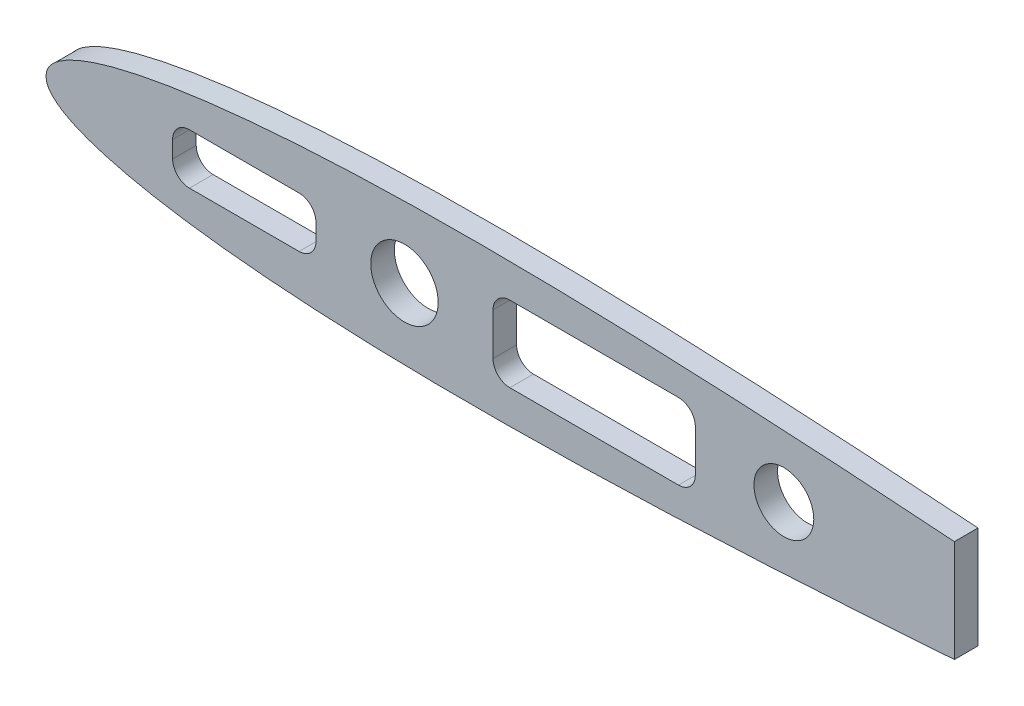
ISO-10303-21;
HEADER;
FILE_DESCRIPTION(('STEP AP214'),'2;1');
FILE_NAME('part.step','',(''),(''),'','','');
FILE_SCHEMA(('AUTOMOTIVE_DESIGN { 1 0 10303 214 1 1 1 1 }'));
ENDSEC;
DATA;
#1=APPLICATION_CONTEXT('core data for automotive mechanical design processes');
#2=APPLICATION_PROTOCOL_DEFINITION('international standard','automotive_design',2000,#1);
#3=PRODUCT_CONTEXT('',#1,'mechanical');
#4=PRODUCT('Part','Part','',(#3));
#5=PRODUCT_RELATED_PRODUCT_CATEGORY('part','',(#4));
#6=PRODUCT_DEFINITION_FORMATION('','',#4);
#7=PRODUCT_DEFINITION_CONTEXT('part definition',#1,'design');
#8=PRODUCT_DEFINITION('design','',#6,#7);
#9=PRODUCT_DEFINITION_SHAPE('','',#8);
#10=(LENGTH_UNIT() NAMED_UNIT(*) SI_UNIT(.MILLI.,.METRE.));
#11=(NAMED_UNIT(*) PLANE_ANGLE_UNIT() SI_UNIT($,.RADIAN.));
#12=(NAMED_UNIT(*) SI_UNIT($,.STERADIAN.) SOLID_ANGLE_UNIT());
#13=UNCERTAINTY_MEASURE_WITH_UNIT(LENGTH_MEASURE(1.E-05),#10,'distance_accuracy_value','');
#14=(GEOMETRIC_REPRESENTATION_CONTEXT(3) GLOBAL_UNCERTAINTY_ASSIGNED_CONTEXT((#13)) GLOBAL_UNIT_ASSIGNED_CONTEXT((#10,
#11,#12)) REPRESENTATION_CONTEXT('',''));
#15=CARTESIAN_POINT('',(0.,0.,0.));
#16=DIRECTION('',(0.,0.,1.));
#17=DIRECTION('',(1.,0.,0.));
#18=AXIS2_PLACEMENT_3D('',#15,#16,#17);
#19=CARTESIAN_POINT('',(217.74763411893,0.,1.4));
#20=DIRECTION('',(1.,0.,0.));
#21=DIRECTION('',(0.,0.,-1.));
#22=AXIS2_PLACEMENT_3D('',#19,#20,#21);
#23=PLANE('',#22);
#24=DIRECTION('',(0.,-1.,0.));
#25=VECTOR('',#24,1.);
#26=CARTESIAN_POINT('',(217.74763411893,0.,-1.4));
#27=LINE('',#26,#25);
#28=CARTESIAN_POINT('',(217.74763411893,6.05811307778919,-1.4));
#29=VERTEX_POINT('',#28);
#30=CARTESIAN_POINT('',(217.74763411893,-6.05811307778918,-1.4));
#31=VERTEX_POINT('',#30);
#32=EDGE_CURVE('E178',#29,#31,#27,.T.);
#33=ORIENTED_EDGE('',*,*,#32,.F.);
#34=DIRECTION('',(0.,0.,-1.));
#35=VECTOR('',#34,1.);
#36=CARTESIAN_POINT('',(217.74763411893,6.05811307778919,1.4));
#37=LINE('',#36,#35);
#38=CARTESIAN_POINT('',(217.74763411893,6.05811307778919,1.4));
#39=VERTEX_POINT('',#38);
#40=EDGE_CURVE('E11',#39,#29,#37,.T.);
#41=ORIENTED_EDGE('',*,*,#40,.F.);
#42=DIRECTION('',(0.,-1.,0.));
#43=VECTOR('',#42,1.);
#44=CARTESIAN_POINT('',(217.74763411893,0.,1.4));
#45=LINE('',#44,#43);
#46=CARTESIAN_POINT('',(217.74763411893,-6.05811307778918,1.4));
#47=VERTEX_POINT('',#46);
#48=EDGE_CURVE('E177',#39,#47,#45,.T.);
#49=ORIENTED_EDGE('',*,*,#48,.T.);
#50=DIRECTION('',(0.,0.,-1.));
#51=VECTOR('',#50,1.);
#52=CARTESIAN_POINT('',(217.74763411893,-6.05811307778918,1.4));
#53=LINE('',#52,#51);
#54=EDGE_CURVE('E122',#47,#31,#53,.T.);
#55=ORIENTED_EDGE('',*,*,#54,.T.);
#56=EDGE_LOOP('',(#33,#41,#49,#55));
#57=FACE_BOUND('',#56,.T.);
#58=ADVANCED_FACE('F35',(#57),#23,.T.);
#59=CARTESIAN_POINT('',(280.,0.1785,1.4));
#60=CARTESIAN_POINT('',(279.592043703671,0.226075897783467,1.4));
#61=CARTESIAN_POINT('',(278.452596210234,0.358958360844463,1.4));
#62=CARTESIAN_POINT('',(276.385426802208,0.596436481937331,1.4));
#63=CARTESIAN_POINT('',(273.651166983567,0.905304265461348,1.4));
#64=CARTESIAN_POINT('',(270.455833183168,1.25859090467058,1.4));
#65=CARTESIAN_POINT('',(266.898988861825,1.64260730411104,1.4));
#66=CARTESIAN_POINT('',(263.047743378214,2.04785660385741,1.4));
#67=CARTESIAN_POINT('',(258.952644661846,2.46718813772148,1.4));
#68=CARTESIAN_POINT('',(253.11611192075,3.04786904369115,1.4));
#69=CARTESIAN_POINT('',(247.071089235748,3.62220530992837,1.4));
#70=CARTESIAN_POINT('',(240.854179313273,4.18491264898859,1.4));
#71=CARTESIAN_POINT('',(236.038226964104,4.60581174883637,1.4));
#72=CARTESIAN_POINT('',(231.150377302514,5.0173511026198,1.4));
#73=CARTESIAN_POINT('',(226.209311113549,5.41695826474113,1.4));
#74=CARTESIAN_POINT('',(221.232257466585,5.802244474926,1.4));
#75=CARTESIAN_POINT('',(216.235178286272,6.17086457697306,1.4));
#76=CARTESIAN_POINT('',(211.232977593233,6.52047434958791,1.4));
#77=CARTESIAN_POINT('',(206.239642946259,6.84887299963153,1.4));
#78=CARTESIAN_POINT('',(201.268368916985,7.15382688632495,1.4));
#79=CARTESIAN_POINT('',(196.331634567492,7.43310533690328,1.4));
#80=CARTESIAN_POINT('',(191.441311474098,7.68460443906704,1.4));
#81=CARTESIAN_POINT('',(186.608700126931,7.90621829286941,1.4));
#82=CARTESIAN_POINT('',(181.844626933159,8.09595849303594,1.4));
#83=CARTESIAN_POINT('',(177.159453511195,8.25195768192942,1.4));
#84=CARTESIAN_POINT('',(172.563150271755,8.37248656398387,1.4));
#85=CARTESIAN_POINT('',(168.065295924147,8.45595366245417,1.4));
#86=CARTESIAN_POINT('',(163.675147454163,8.5010026998616,1.4));
#87=CARTESIAN_POINT('',(159.401643403725,8.50652296727326,1.4));
#88=CARTESIAN_POINT('',(155.253439755899,8.47152880790102,1.4));
#89=CARTESIAN_POINT('',(151.238917925322,8.39550607585732,1.4));
#90=CARTESIAN_POINT('',(147.366223919106,8.27798597685019,1.4));
#91=CARTESIAN_POINT('',(143.643266298458,8.11897556141504,1.4));
#92=CARTESIAN_POINT('',(140.077743555427,7.91867894287145,1.4));
#93=CARTESIAN_POINT('',(136.677139412155,7.67760454203032,1.4));
#94=CARTESIAN_POINT('',(133.44876289533,7.39648056861162,1.4));
#95=CARTESIAN_POINT('',(130.399721685833,7.07642431038863,1.4));
#96=CARTESIAN_POINT('',(127.536961088608,6.71865034112428,1.4));
#97=CARTESIAN_POINT('',(124.867245825052,6.32466607739586,1.4));
#98=CARTESIAN_POINT('',(122.397158973637,5.89612056643678,1.4));
#99=CARTESIAN_POINT('',(120.133109351335,5.43479747619412,1.4));
#100=CARTESIAN_POINT('',(118.081312132678,4.94256764101073,1.4));
#101=CARTESIAN_POINT('',(116.247665797811,4.42139238611828,1.4));
#102=CARTESIAN_POINT('',(114.637939719778,3.87306046577258,1.4));
#103=CARTESIAN_POINT('',(113.256788366372,3.29930923783808,1.4));
#104=CARTESIAN_POINT('',(112.109835923497,2.70130638754162,1.4));
#105=CARTESIAN_POINT('',(111.196336340545,2.07855523302877,1.4));
#106=CARTESIAN_POINT('',(110.530223641577,1.42706975809109,1.4));
#107=CARTESIAN_POINT('',(110.085538217979,0.734230220465984,1.4));
#108=CARTESIAN_POINT('',(110.027578175867,0.236721440142773,1.4));
#109=CARTESIAN_POINT('',(110.,0.,1.4));
#110=B_SPLINE_CURVE_WITH_KNOTS('',3,(#59,#60,#61,#62,#63,#64,#65,#66,#67,#68,#69,#70,#71,#72,
#73,#74,#75,#76,#77,#78,#79,#80,#81,#82,#83,#84,#85,#86,#87,#88,#89,#90,#91,#92,#93,#94,#95,#96,
#97,#98,#99,#100,#101,#102,#103,#104,#105,#106,#107,#108,#109),.UNSPECIFIED.,.F.,.F.,(4,1,1,1,1,
1,1,1,1,1,1,1,1,1,1,1,1,1,1,1,1,1,1,1,1,1,1,1,1,1,1,1,1,1,1,1,1,1,1,1,1,1,1,1,1,1,1,1,4),(0.,
0.00714472364101537,0.0199556607345446,0.0361960612227423,0.0550111837630616,0.0758789375062231,
0.0984288660950085,0.122375554002083,0.147487885417653,0.200459747132314,0.228005170188377,
0.256076453638138,0.284555151070125,0.31333276259982,0.342309553949656,0.371392651251454,
0.400495752426115,0.429537687145242,0.458441905920554,0.487136113386761,0.515551917136779,
0.543623846405843,0.571289984327897,0.598490809568145,0.625169613225281,0.651272029103837,
0.676746157949116,0.701541790883913,0.725611016556625,0.74890783507394,0.771387785068823,
0.793008138575143,0.813728032856974,0.833507815357633,0.852309696093785,0.870097310144046,
0.886835918069106,0.902492781713446,0.917037139140432,0.930441053860646,0.942679762162792,
0.953733567025024,0.963589785484808,0.97224701929817,0.979722225388436,0.986065145275041,
0.991385258303778,0.995900988803729,1.),.UNSPECIFIED.);
#111=DIRECTION('',(0.,0.,-1.));
#112=VECTOR('',#111,1.);
#113=SURFACE_OF_LINEAR_EXTRUSION('',#110,#112);
#114=CARTESIAN_POINT('',(280.,0.1785,-1.4));
#115=CARTESIAN_POINT('',(279.592043703671,0.226075897783467,-1.4));
#116=CARTESIAN_POINT('',(278.452596210234,0.358958360844463,-1.4));
#117=CARTESIAN_POINT('',(276.385426802208,0.596436481937331,-1.4));
#118=CARTESIAN_POINT('',(273.651166983567,0.905304265461348,-1.4));
#119=CARTESIAN_POINT('',(270.455833183168,1.25859090467058,-1.4));
#120=CARTESIAN_POINT('',(266.898988861825,1.64260730411104,-1.4));
#121=CARTESIAN_POINT('',(263.047743378214,2.04785660385741,-1.4));
#122=CARTESIAN_POINT('',(258.952644661846,2.46718813772148,-1.4));
#123=CARTESIAN_POINT('',(253.11611192075,3.04786904369115,-1.4));
#124=CARTESIAN_POINT('',(247.071089235748,3.62220530992837,-1.4));
#125=CARTESIAN_POINT('',(240.854179313273,4.18491264898859,-1.4));
#126=CARTESIAN_POINT('',(236.038226964104,4.60581174883637,-1.4));
#127=CARTESIAN_POINT('',(231.150377302514,5.0173511026198,-1.4));
#128=CARTESIAN_POINT('',(226.209311113549,5.41695826474113,-1.4));
#129=CARTESIAN_POINT('',(221.232257466585,5.802244474926,-1.4));
#130=CARTESIAN_POINT('',(216.235178286272,6.17086457697306,-1.4));
#131=CARTESIAN_POINT('',(211.232977593233,6.52047434958791,-1.4));
#132=CARTESIAN_POINT('',(206.239642946259,6.84887299963153,-1.4));
#133=CARTESIAN_POINT('',(201.268368916985,7.15382688632495,-1.4));
#134=CARTESIAN_POINT('',(196.331634567492,7.43310533690328,-1.4));
#135=CARTESIAN_POINT('',(191.441311474098,7.68460443906704,-1.4));
#136=CARTESIAN_POINT('',(186.608700126931,7.90621829286941,-1.4));
#137=CARTESIAN_POINT('',(181.844626933159,8.09595849303594,-1.4));
#138=CARTESIAN_POINT('',(177.159453511195,8.25195768192942,-1.4));
#139=CARTESIAN_POINT('',(172.563150271755,8.37248656398387,-1.4));
#140=CARTESIAN_POINT('',(168.065295924147,8.45595366245417,-1.4));
#141=CARTESIAN_POINT('',(163.675147454163,8.5010026998616,-1.4));
#142=CARTESIAN_POINT('',(159.401643403725,8.50652296727326,-1.4));
#143=CARTESIAN_POINT('',(155.253439755899,8.47152880790102,-1.4));
#144=CARTESIAN_POINT('',(151.238917925322,8.39550607585732,-1.4));
#145=CARTESIAN_POINT('',(147.366223919106,8.27798597685019,-1.4));
#146=CARTESIAN_POINT('',(143.643266298458,8.11897556141504,-1.4));
#147=CARTESIAN_POINT('',(140.077743555427,7.91867894287145,-1.4));
#148=CARTESIAN_POINT('',(136.677139412155,7.67760454203032,-1.4));
#149=CARTESIAN_POINT('',(133.44876289533,7.39648056861162,-1.4));
#150=CARTESIAN_POINT('',(130.399721685833,7.07642431038863,-1.4));
#151=CARTESIAN_POINT('',(127.536961088608,6.71865034112428,-1.4));
#152=CARTESIAN_POINT('',(124.867245825052,6.32466607739586,-1.4));
#153=CARTESIAN_POINT('',(122.397158973637,5.89612056643678,-1.4));
#154=CARTESIAN_POINT('',(120.133109351335,5.43479747619412,-1.4));
#155=CARTESIAN_POINT('',(118.081312132678,4.94256764101073,-1.4));
#156=CARTESIAN_POINT('',(116.247665797811,4.42139238611828,-1.4));
#157=CARTESIAN_POINT('',(114.637939719778,3.87306046577258,-1.4));
#158=CARTESIAN_POINT('',(113.256788366372,3.29930923783808,-1.4));
#159=CARTESIAN_POINT('',(112.109835923497,2.70130638754162,-1.4));
#160=CARTESIAN_POINT('',(111.196336340545,2.07855523302877,-1.4));
#161=CARTESIAN_POINT('',(110.530223641577,1.42706975809109,-1.4));
#162=CARTESIAN_POINT('',(110.085538217979,0.734230220465984,-1.4));
#163=CARTESIAN_POINT('',(110.027578175867,0.236721440142773,-1.4));
#164=CARTESIAN_POINT('',(110.,0.,-1.4));
#165=B_SPLINE_CURVE_WITH_KNOTS('',3,(#114,#115,#116,#117,#118,#119,#120,#121,#122,#123,#124,
#125,#126,#127,#128,#129,#130,#131,#132,#133,#134,#135,#136,#137,#138,#139,#140,#141,#142,#143,
#144,#145,#146,#147,#148,#149,#150,#151,#152,#153,#154,#155,#156,#157,#158,#159,#160,#161,#162,
#163,#164),.UNSPECIFIED.,.F.,.F.,(4,1,1,1,1,1,1,1,1,1,1,1,1,1,1,1,1,1,1,1,1,1,1,1,1,1,1,1,1,1,1,
1,1,1,1,1,1,1,1,1,1,1,1,1,1,1,1,1,4),(0.,0.00714472364101537,0.0199556607345446,
0.0361960612227423,0.0550111837630616,0.0758789375062231,0.0984288660950085,0.122375554002083,
0.147487885417653,0.200459747132314,0.228005170188377,0.256076453638138,0.284555151070125,
0.31333276259982,0.342309553949656,0.371392651251454,0.400495752426115,0.429537687145242,
0.458441905920554,0.487136113386761,0.515551917136779,0.543623846405843,0.571289984327897,
0.598490809568145,0.625169613225281,0.651272029103837,0.676746157949116,0.701541790883913,
0.725611016556625,0.74890783507394,0.771387785068823,0.793008138575143,0.813728032856974,
0.833507815357633,0.852309696093785,0.870097310144046,0.886835918069106,0.902492781713446,
0.917037139140432,0.930441053860646,0.942679762162792,0.953733567025024,0.963589785484808,
0.97224701929817,0.979722225388436,0.986065145275041,0.991385258303778,0.995900988803729,1.),.UNSPECIFIED.);
#166=CARTESIAN_POINT('',(110.,0.,-1.4));
#167=VERTEX_POINT('',#166);
#168=EDGE_CURVE('E338',#29,#167,#165,.T.);
#169=ORIENTED_EDGE('',*,*,#168,.T.);
#170=DIRECTION('',(0.,0.,-1.));
#171=VECTOR('',#170,1.);
#172=CARTESIAN_POINT('',(110.,0.,1.4));
#173=LINE('',#172,#171);
#174=CARTESIAN_POINT('',(110.,0.,1.4));
#175=VERTEX_POINT('',#174);
#176=EDGE_CURVE('E45',#175,#167,#173,.T.);
#177=ORIENTED_EDGE('',*,*,#176,.F.);
#178=EDGE_CURVE('E182',#39,#175,#110,.T.);
#179=ORIENTED_EDGE('',*,*,#178,.F.);
#180=ORIENTED_EDGE('',*,*,#40,.T.);
#181=EDGE_LOOP('',(#169,#177,#179,#180));
#182=FACE_BOUND('',#181,.T.);
#183=ADVANCED_FACE('F183',(#182),#113,.F.);
#184=CARTESIAN_POINT('',(163.018484280221,0.,1.4));
#185=DIRECTION('',(-1.,0.,0.));
#186=DIRECTION('',(0.,0.,1.));
#187=AXIS2_PLACEMENT_3D('',#184,#185,#186);
#188=PLANE('',#187);
#189=DIRECTION('',(0.,1.,0.));
#190=VECTOR('',#189,1.);
#191=CARTESIAN_POINT('',(163.018484280221,0.,-1.4));
#192=LINE('',#191,#190);
#193=CARTESIAN_POINT('',(163.018484280221,-2.5,-1.4));
#194=VERTEX_POINT('',#193);
#195=CARTESIAN_POINT('',(163.018484280221,2.5,-1.4));
#196=VERTEX_POINT('',#195);
#197=EDGE_CURVE('E310',#194,#196,#192,.T.);
#198=ORIENTED_EDGE('',*,*,#197,.T.);
#199=DIRECTION('',(0.,0.,-1.));
#200=VECTOR('',#199,1.);
#201=CARTESIAN_POINT('',(163.018484280221,2.5,1.4));
#202=LINE('',#201,#200);
#203=CARTESIAN_POINT('',(163.018484280221,2.5,1.4));
#204=VERTEX_POINT('',#203);
#205=EDGE_CURVE('E353',#204,#196,#202,.T.);
#206=ORIENTED_EDGE('',*,*,#205,.F.);
#207=DIRECTION('',(0.,1.,0.));
#208=VECTOR('',#207,1.);
#209=CARTESIAN_POINT('',(163.018484280221,0.,1.4));
#210=LINE('',#209,#208);
#211=CARTESIAN_POINT('',(163.018484280221,-2.5,1.4));
#212=VERTEX_POINT('',#211);
#213=EDGE_CURVE('E408',#212,#204,#210,.T.);
#214=ORIENTED_EDGE('',*,*,#213,.F.);
#215=DIRECTION('',(0.,0.,-1.));
#216=VECTOR('',#215,1.);
#217=CARTESIAN_POINT('',(163.018484280221,-2.5,1.4));
#218=LINE('',#217,#216);
#219=EDGE_CURVE('E355',#212,#194,#218,.T.);
#220=ORIENTED_EDGE('',*,*,#219,.T.);
#221=EDGE_LOOP('',(#198,#206,#214,#220));
#222=FACE_BOUND('',#221,.T.);
#223=ADVANCED_FACE('F207',(#222),#188,.F.);
#224=CARTESIAN_POINT('',(165.018484280221,2.5,1.4));
#225=DIRECTION('',(0.,0.,-1.));
#226=DIRECTION('',(-1.,0.,0.));
#227=AXIS2_PLACEMENT_3D('',#224,#225,#226);
#228=CYLINDRICAL_SURFACE('',#227,2.);
#229=CARTESIAN_POINT('',(165.018484280221,2.5,-1.4));
#230=DIRECTION('',(0.,0.,1.));
#231=DIRECTION('',(1.,0.,0.));
#232=AXIS2_PLACEMENT_3D('',#229,#230,#231);
#233=CIRCLE('',#232,2.);
#234=CARTESIAN_POINT('',(165.018484280221,4.5,-1.4));
#235=VERTEX_POINT('',#234);
#236=EDGE_CURVE('E313',#196,#235,#233,.F.);
#237=ORIENTED_EDGE('',*,*,#236,.T.);
#238=DIRECTION('',(0.,0.,-1.));
#239=VECTOR('',#238,1.);
#240=CARTESIAN_POINT('',(165.018484280221,4.5,1.4));
#241=LINE('',#240,#239);
#242=CARTESIAN_POINT('',(165.018484280221,4.5,1.4));
#243=VERTEX_POINT('',#242);
#244=EDGE_CURVE('E369',#243,#235,#241,.T.);
#245=ORIENTED_EDGE('',*,*,#244,.F.);
#246=CARTESIAN_POINT('',(165.018484280221,2.5,1.4));
#247=DIRECTION('',(0.,0.,1.));
#248=DIRECTION('',(1.,0.,0.));
#249=AXIS2_PLACEMENT_3D('',#246,#247,#248);
#250=CIRCLE('',#249,2.);
#251=EDGE_CURVE('E411',#204,#243,#250,.F.);
#252=ORIENTED_EDGE('',*,*,#251,.F.);
#253=ORIENTED_EDGE('',*,*,#205,.T.);
#254=EDGE_LOOP('',(#237,#245,#252,#253));
#255=FACE_BOUND('',#254,.T.);
#256=ADVANCED_FACE('F245',(#255),#228,.F.);
#257=CARTESIAN_POINT('',(0.,4.5,1.4));
#258=DIRECTION('',(0.,1.,0.));
#259=DIRECTION('',(0.,0.,1.));
#260=AXIS2_PLACEMENT_3D('',#257,#258,#259);
#261=PLANE('',#260);
#262=DIRECTION('',(1.,0.,0.));
#263=VECTOR('',#262,1.);
#264=CARTESIAN_POINT('',(0.,4.5,-1.4));
#265=LINE('',#264,#263);
#266=CARTESIAN_POINT('',(185.018484280221,4.5,-1.4));
#267=VERTEX_POINT('',#266);
#268=EDGE_CURVE('E315',#235,#267,#265,.T.);
#269=ORIENTED_EDGE('',*,*,#268,.T.);
#270=DIRECTION('',(0.,0.,-1.));
#271=VECTOR('',#270,1.);
#272=CARTESIAN_POINT('',(185.018484280221,4.5,1.4));
#273=LINE('',#272,#271);
#274=CARTESIAN_POINT('',(185.018484280221,4.5,1.4));
#275=VERTEX_POINT('',#274);
#276=EDGE_CURVE('E366',#275,#267,#273,.T.);
#277=ORIENTED_EDGE('',*,*,#276,.F.);
#278=DIRECTION('',(1.,0.,0.));
#279=VECTOR('',#278,1.);
#280=CARTESIAN_POINT('',(0.,4.5,1.4));
#281=LINE('',#280,#279);
#282=EDGE_CURVE('E413',#243,#275,#281,.T.);
#283=ORIENTED_EDGE('',*,*,#282,.F.);
#284=ORIENTED_EDGE('',*,*,#244,.T.);
#285=EDGE_LOOP('',(#269,#277,#283,#284));
#286=FACE_BOUND('',#285,.T.);
#287=ADVANCED_FACE('F241',(#286),#261,.F.);
#288=CARTESIAN_POINT('',(185.018484280221,2.5,1.4));
#289=DIRECTION('',(0.,0.,-1.));
#290=DIRECTION('',(-1.,0.,0.));
#291=AXIS2_PLACEMENT_3D('',#288,#289,#290);
#292=CYLINDRICAL_SURFACE('',#291,2.);
#293=CARTESIAN_POINT('',(185.018484280221,2.5,-1.4));
#294=DIRECTION('',(0.,0.,1.));
#295=DIRECTION('',(1.,0.,0.));
#296=AXIS2_PLACEMENT_3D('',#293,#294,#295);
#297=CIRCLE('',#296,2.);
#298=CARTESIAN_POINT('',(187.018484280221,2.5,-1.4));
#299=VERTEX_POINT('',#298);
#300=EDGE_CURVE('E317',#267,#299,#297,.F.);
#301=ORIENTED_EDGE('',*,*,#300,.T.);
#302=DIRECTION('',(0.,0.,-1.));
#303=VECTOR('',#302,1.);
#304=CARTESIAN_POINT('',(187.018484280221,2.5,1.4));
#305=LINE('',#304,#303);
#306=CARTESIAN_POINT('',(187.018484280221,2.5,1.4));
#307=VERTEX_POINT('',#306);
#308=EDGE_CURVE('E364',#307,#299,#305,.T.);
#309=ORIENTED_EDGE('',*,*,#308,.F.);
#310=CARTESIAN_POINT('',(185.018484280221,2.5,1.4));
#311=DIRECTION('',(0.,0.,1.));
#312=DIRECTION('',(1.,0.,0.));
#313=AXIS2_PLACEMENT_3D('',#310,#311,#312);
#314=CIRCLE('',#313,2.);
#315=EDGE_CURVE('E415',#275,#307,#314,.F.);
#316=ORIENTED_EDGE('',*,*,#315,.F.);
#317=ORIENTED_EDGE('',*,*,#276,.T.);
#318=EDGE_LOOP('',(#301,#309,#316,#317));
#319=FACE_BOUND('',#318,.T.);
#320=ADVANCED_FACE('F237',(#319),#292,.F.);
#321=CARTESIAN_POINT('',(187.018484280221,0.,1.4));
#322=DIRECTION('',(-1.,0.,0.));
#323=DIRECTION('',(0.,0.,1.));
#324=AXIS2_PLACEMENT_3D('',#321,#322,#323);
#325=PLANE('',#324);
#326=DIRECTION('',(0.,1.,0.));
#327=VECTOR('',#326,1.);
#328=CARTESIAN_POINT('',(187.018484280221,0.,-1.4));
#329=LINE('',#328,#327);
#330=CARTESIAN_POINT('',(187.018484280221,-2.5,-1.4));
#331=VERTEX_POINT('',#330);
#332=EDGE_CURVE('E320',#331,#299,#329,.T.);
#333=ORIENTED_EDGE('',*,*,#332,.F.);
#334=DIRECTION('',(0.,0.,-1.));
#335=VECTOR('',#334,1.);
#336=CARTESIAN_POINT('',(187.018484280221,-2.5,1.4));
#337=LINE('',#336,#335);
#338=CARTESIAN_POINT('',(187.018484280221,-2.5,1.4));
#339=VERTEX_POINT('',#338);
#340=EDGE_CURVE('E362',#339,#331,#337,.T.);
#341=ORIENTED_EDGE('',*,*,#340,.F.);
#342=DIRECTION('',(0.,1.,0.));
#343=VECTOR('',#342,1.);
#344=CARTESIAN_POINT('',(187.018484280221,0.,1.4));
#345=LINE('',#344,#343);
#346=EDGE_CURVE('E417',#339,#307,#345,.T.);
#347=ORIENTED_EDGE('',*,*,#346,.T.);
#348=ORIENTED_EDGE('',*,*,#308,.T.);
#349=EDGE_LOOP('',(#333,#341,#347,#348));
#350=FACE_BOUND('',#349,.T.);
#351=ADVANCED_FACE('F233',(#350),#325,.T.);
#352=CARTESIAN_POINT('',(185.018484280221,-2.5,1.4));
#353=DIRECTION('',(0.,0.,-1.));
#354=DIRECTION('',(-1.,0.,0.));
#355=AXIS2_PLACEMENT_3D('',#352,#353,#354);
#356=CYLINDRICAL_SURFACE('',#355,2.);
#357=CARTESIAN_POINT('',(185.018484280221,-2.5,-1.4));
#358=DIRECTION('',(0.,0.,1.));
#359=DIRECTION('',(1.,0.,0.));
#360=AXIS2_PLACEMENT_3D('',#357,#358,#359);
#361=CIRCLE('',#360,2.);
#362=CARTESIAN_POINT('',(185.018484280221,-4.5,-1.4));
#363=VERTEX_POINT('',#362);
#364=EDGE_CURVE('E323',#363,#331,#361,.T.);
#365=ORIENTED_EDGE('',*,*,#364,.F.);
#366=DIRECTION('',(0.,0.,-1.));
#367=VECTOR('',#366,1.);
#368=CARTESIAN_POINT('',(185.018484280221,-4.5,1.4));
#369=LINE('',#368,#367);
#370=CARTESIAN_POINT('',(185.018484280221,-4.5,1.4));
#371=VERTEX_POINT('',#370);
#372=EDGE_CURVE('E360',#371,#363,#369,.T.);
#373=ORIENTED_EDGE('',*,*,#372,.F.);
#374=CARTESIAN_POINT('',(185.018484280221,-2.5,1.4));
#375=DIRECTION('',(0.,0.,1.));
#376=DIRECTION('',(1.,0.,0.));
#377=AXIS2_PLACEMENT_3D('',#374,#375,#376);
#378=CIRCLE('',#377,2.);
#379=EDGE_CURVE('E420',#371,#339,#378,.T.);
#380=ORIENTED_EDGE('',*,*,#379,.T.);
#381=ORIENTED_EDGE('',*,*,#340,.T.);
#382=EDGE_LOOP('',(#365,#373,#380,#381));
#383=FACE_BOUND('',#382,.T.);
#384=ADVANCED_FACE('F229',(#383),#356,.F.);
#385=CARTESIAN_POINT('',(0.,-4.5,1.4));
#386=DIRECTION('',(0.,1.,0.));
#387=DIRECTION('',(0.,0.,1.));
#388=AXIS2_PLACEMENT_3D('',#385,#386,#387);
#389=PLANE('',#388);
#390=DIRECTION('',(1.,0.,0.));
#391=VECTOR('',#390,1.);
#392=CARTESIAN_POINT('',(0.,-4.5,-1.4));
#393=LINE('',#392,#391);
#394=CARTESIAN_POINT('',(165.018484280221,-4.5,-1.4));
#395=VERTEX_POINT('',#394);
#396=EDGE_CURVE('E326',#395,#363,#393,.T.);
#397=ORIENTED_EDGE('',*,*,#396,.F.);
#398=DIRECTION('',(0.,0.,-1.));
#399=VECTOR('',#398,1.);
#400=CARTESIAN_POINT('',(165.018484280221,-4.5,1.4));
#401=LINE('',#400,#399);
#402=CARTESIAN_POINT('',(165.018484280221,-4.5,1.4));
#403=VERTEX_POINT('',#402);
#404=EDGE_CURVE('E358',#403,#395,#401,.T.);
#405=ORIENTED_EDGE('',*,*,#404,.F.);
#406=DIRECTION('',(1.,0.,0.));
#407=VECTOR('',#406,1.);
#408=CARTESIAN_POINT('',(0.,-4.5,1.4));
#409=LINE('',#408,#407);
#410=EDGE_CURVE('E423',#403,#371,#409,.T.);
#411=ORIENTED_EDGE('',*,*,#410,.T.);
#412=ORIENTED_EDGE('',*,*,#372,.T.);
#413=EDGE_LOOP('',(#397,#405,#411,#412));
#414=FACE_BOUND('',#413,.T.);
#415=ADVANCED_FACE('F226',(#414),#389,.T.);
#416=CARTESIAN_POINT('',(0.,3.,1.4));
#417=DIRECTION('',(0.,1.,0.));
#418=DIRECTION('',(0.,0.,1.));
#419=AXIS2_PLACEMENT_3D('',#416,#417,#418);
#420=PLANE('',#419);
#421=DIRECTION('',(1.,0.,0.));
#422=VECTOR('',#421,1.);
#423=CARTESIAN_POINT('',(0.,3.,-1.4));
#424=LINE('',#423,#422);
#425=CARTESIAN_POINT('',(127.018484280221,3.,-1.4));
#426=VERTEX_POINT('',#425);
#427=CARTESIAN_POINT('',(140.018484280221,3.,-1.4));
#428=VERTEX_POINT('',#427);
#429=EDGE_CURVE('E290',#426,#428,#424,.T.);
#430=ORIENTED_EDGE('',*,*,#429,.T.);
#431=DIRECTION('',(0.,0.,-1.));
#432=VECTOR('',#431,1.);
#433=CARTESIAN_POINT('',(140.018484280221,3.,1.4));
#434=LINE('',#433,#432);
#435=CARTESIAN_POINT('',(140.018484280221,3.,1.4));
#436=VERTEX_POINT('',#435);
#437=EDGE_CURVE('E39',#436,#428,#434,.T.);
#438=ORIENTED_EDGE('',*,*,#437,.F.);
#439=DIRECTION('',(1.,0.,0.));
#440=VECTOR('',#439,1.);
#441=CARTESIAN_POINT('',(0.,3.,1.4));
#442=LINE('',#441,#440);
#443=CARTESIAN_POINT('',(127.018484280221,3.,1.4));
#444=VERTEX_POINT('',#443);
#445=EDGE_CURVE('E348',#444,#436,#442,.T.);
#446=ORIENTED_EDGE('',*,*,#445,.F.);
#447=DIRECTION('',(0.,0.,-1.));
#448=VECTOR('',#447,1.);
#449=CARTESIAN_POINT('',(127.018484280221,3.,1.4));
#450=LINE('',#449,#448);
#451=EDGE_CURVE('E374',#444,#426,#450,.T.);
#452=ORIENTED_EDGE('',*,*,#451,.T.);
#453=EDGE_LOOP('',(#430,#438,#446,#452));
#454=FACE_BOUND('',#453,.T.);
#455=ADVANCED_FACE('F37',(#454),#420,.F.);
#456=CARTESIAN_POINT('',(140.018484280221,1.,1.4));
#457=DIRECTION('',(0.,0.,-1.));
#458=DIRECTION('',(-1.,0.,0.));
#459=AXIS2_PLACEMENT_3D('',#456,#457,#458);
#460=CYLINDRICAL_SURFACE('',#459,2.);
#461=CARTESIAN_POINT('',(140.018484280221,1.,-1.4));
#462=DIRECTION('',(0.,0.,1.));
#463=DIRECTION('',(1.,0.,0.));
#464=AXIS2_PLACEMENT_3D('',#461,#462,#463);
#465=CIRCLE('',#464,2.);
#466=CARTESIAN_POINT('',(142.018484280221,0.999999999999986,-1.4));
#467=VERTEX_POINT('',#466);
#468=EDGE_CURVE('E281',#428,#467,#465,.F.);
#469=ORIENTED_EDGE('',*,*,#468,.T.);
#470=DIRECTION('',(0.,0.,-1.));
#471=VECTOR('',#470,1.);
#472=CARTESIAN_POINT('',(142.018484280221,0.999999999999986,1.4));
#473=LINE('',#472,#471);
#474=CARTESIAN_POINT('',(142.018484280221,0.999999999999986,1.4));
#475=VERTEX_POINT('',#474);
#476=EDGE_CURVE('E283',#475,#467,#473,.T.);
#477=ORIENTED_EDGE('',*,*,#476,.F.);
#478=CARTESIAN_POINT('',(140.018484280221,1.,1.4));
#479=DIRECTION('',(0.,0.,1.));
#480=DIRECTION('',(1.,0.,0.));
#481=AXIS2_PLACEMENT_3D('',#478,#479,#480);
#482=CIRCLE('',#481,2.);
#483=EDGE_CURVE('E130',#436,#475,#482,.F.);
#484=ORIENTED_EDGE('',*,*,#483,.F.);
#485=ORIENTED_EDGE('',*,*,#437,.T.);
#486=EDGE_LOOP('',(#469,#477,#484,#485));
#487=FACE_BOUND('',#486,.T.);
#488=ADVANCED_FACE('F273',(#487),#460,.F.);
#489=CARTESIAN_POINT('',(142.018484280221,0.,1.4));
#490=DIRECTION('',(-1.,0.,0.));
#491=DIRECTION('',(0.,0.,1.));
#492=AXIS2_PLACEMENT_3D('',#489,#490,#491);
#493=PLANE('',#492);
#494=DIRECTION('',(0.,1.,0.));
#495=VECTOR('',#494,1.);
#496=CARTESIAN_POINT('',(142.018484280221,0.,-1.4));
#497=LINE('',#496,#495);
#498=CARTESIAN_POINT('',(142.018484280221,-0.999999999999985,-1.4));
#499=VERTEX_POINT('',#498);
#500=EDGE_CURVE('E289',#499,#467,#497,.T.);
#501=ORIENTED_EDGE('',*,*,#500,.F.);
#502=DIRECTION('',(0.,0.,-1.));
#503=VECTOR('',#502,1.);
#504=CARTESIAN_POINT('',(142.018484280221,-0.999999999999985,1.4));
#505=LINE('',#504,#503);
#506=CARTESIAN_POINT('',(142.018484280221,-0.999999999999985,1.4));
#507=VERTEX_POINT('',#506);
#508=EDGE_CURVE('E387',#507,#499,#505,.T.);
#509=ORIENTED_EDGE('',*,*,#508,.F.);
#510=DIRECTION('',(0.,1.,0.));
#511=VECTOR('',#510,1.);
#512=CARTESIAN_POINT('',(142.018484280221,0.,1.4));
#513=LINE('',#512,#511);
#514=EDGE_CURVE('E389',#507,#475,#513,.T.);
#515=ORIENTED_EDGE('',*,*,#514,.T.);
#516=ORIENTED_EDGE('',*,*,#476,.T.);
#517=EDGE_LOOP('',(#501,#509,#515,#516));
#518=FACE_BOUND('',#517,.T.);
#519=ADVANCED_FACE('F270',(#518),#493,.T.);
#520=CARTESIAN_POINT('',(140.018484280221,-1.,1.4));
#521=DIRECTION('',(0.,0.,-1.));
#522=DIRECTION('',(-1.,0.,0.));
#523=AXIS2_PLACEMENT_3D('',#520,#521,#522);
#524=CYLINDRICAL_SURFACE('',#523,2.);
#525=CARTESIAN_POINT('',(140.018484280221,-1.,-1.4));
#526=DIRECTION('',(0.,0.,1.));
#527=DIRECTION('',(1.,0.,0.));
#528=AXIS2_PLACEMENT_3D('',#525,#526,#527);
#529=CIRCLE('',#528,2.);
#530=CARTESIAN_POINT('',(140.018484280221,-3.,-1.4));
#531=VERTEX_POINT('',#530);
#532=EDGE_CURVE('E298',#531,#499,#529,.T.);
#533=ORIENTED_EDGE('',*,*,#532,.F.);
#534=DIRECTION('',(0.,0.,-1.));
#535=VECTOR('',#534,1.);
#536=CARTESIAN_POINT('',(140.018484280221,-3.,1.4));
#537=LINE('',#536,#535);
#538=CARTESIAN_POINT('',(140.018484280221,-3.,1.4));
#539=VERTEX_POINT('',#538);
#540=EDGE_CURVE('E385',#539,#531,#537,.T.);
#541=ORIENTED_EDGE('',*,*,#540,.F.);
#542=CARTESIAN_POINT('',(140.018484280221,-1.,1.4));
#543=DIRECTION('',(0.,0.,1.));
#544=DIRECTION('',(1.,0.,0.));
#545=AXIS2_PLACEMENT_3D('',#542,#543,#544);
#546=CIRCLE('',#545,2.);
#547=EDGE_CURVE('E393',#539,#507,#546,.T.);
#548=ORIENTED_EDGE('',*,*,#547,.T.);
#549=ORIENTED_EDGE('',*,*,#508,.T.);
#550=EDGE_LOOP('',(#533,#541,#548,#549));
#551=FACE_BOUND('',#550,.T.);
#552=ADVANCED_FACE('F266',(#551),#524,.F.);
#553=CARTESIAN_POINT('',(0.,-3.,1.4));
#554=DIRECTION('',(0.,1.,0.));
#555=DIRECTION('',(0.,0.,1.));
#556=AXIS2_PLACEMENT_3D('',#553,#554,#555);
#557=PLANE('',#556);
#558=DIRECTION('',(1.,0.,0.));
#559=VECTOR('',#558,1.);
#560=CARTESIAN_POINT('',(0.,-3.,-1.4));
#561=LINE('',#560,#559);
#562=CARTESIAN_POINT('',(127.018484280221,-3.,-1.4));
#563=VERTEX_POINT('',#562);
#564=EDGE_CURVE('E300',#563,#531,#561,.T.);
#565=ORIENTED_EDGE('',*,*,#564,.F.);
#566=DIRECTION('',(0.,0.,-1.));
#567=VECTOR('',#566,1.);
#568=CARTESIAN_POINT('',(127.018484280221,-3.,1.4));
#569=LINE('',#568,#567);
#570=CARTESIAN_POINT('',(127.018484280221,-3.,1.4));
#571=VERTEX_POINT('',#570);
#572=EDGE_CURVE('E383',#571,#563,#569,.T.);
#573=ORIENTED_EDGE('',*,*,#572,.F.);
#574=DIRECTION('',(1.,0.,0.));
#575=VECTOR('',#574,1.);
#576=CARTESIAN_POINT('',(0.,-3.,1.4));
#577=LINE('',#576,#575);
#578=EDGE_CURVE('E395',#571,#539,#577,.T.);
#579=ORIENTED_EDGE('',*,*,#578,.T.);
#580=ORIENTED_EDGE('',*,*,#540,.T.);
#581=EDGE_LOOP('',(#565,#573,#579,#580));
#582=FACE_BOUND('',#581,.T.);
#583=ADVANCED_FACE('F262',(#582),#557,.T.);
#584=CARTESIAN_POINT('',(127.018484280221,-1.,1.4));
#585=DIRECTION('',(0.,0.,-1.));
#586=DIRECTION('',(-1.,0.,0.));
#587=AXIS2_PLACEMENT_3D('',#584,#585,#586);
#588=CYLINDRICAL_SURFACE('',#587,2.);
#589=CARTESIAN_POINT('',(127.018484280221,-1.,-1.4));
#590=DIRECTION('',(0.,0.,1.));
#591=DIRECTION('',(1.,0.,0.));
#592=AXIS2_PLACEMENT_3D('',#589,#590,#591);
#593=CIRCLE('',#592,2.);
#594=CARTESIAN_POINT('',(125.018484280221,-0.999999999999985,-1.4));
#595=VERTEX_POINT('',#594);
#596=EDGE_CURVE('E304',#563,#595,#593,.F.);
#597=ORIENTED_EDGE('',*,*,#596,.T.);
#598=DIRECTION('',(0.,0.,-1.));
#599=VECTOR('',#598,1.);
#600=CARTESIAN_POINT('',(125.018484280221,-0.999999999999985,1.4));
#601=LINE('',#600,#599);
#602=CARTESIAN_POINT('',(125.018484280221,-0.999999999999985,1.4));
#603=VERTEX_POINT('',#602);
#604=EDGE_CURVE('E380',#603,#595,#601,.T.);
#605=ORIENTED_EDGE('',*,*,#604,.F.);
#606=CARTESIAN_POINT('',(127.018484280221,-1.,1.4));
#607=DIRECTION('',(0.,0.,1.));
#608=DIRECTION('',(1.,0.,0.));
#609=AXIS2_PLACEMENT_3D('',#606,#607,#608);
#610=CIRCLE('',#609,2.);
#611=EDGE_CURVE('E402',#571,#603,#610,.F.);
#612=ORIENTED_EDGE('',*,*,#611,.F.);
#613=ORIENTED_EDGE('',*,*,#572,.T.);
#614=EDGE_LOOP('',(#597,#605,#612,#613));
#615=FACE_BOUND('',#614,.T.);
#616=ADVANCED_FACE('F258',(#615),#588,.F.);
#617=CARTESIAN_POINT('',(125.018484280221,0.,1.4));
#618=DIRECTION('',(-1.,0.,0.));
#619=DIRECTION('',(0.,0.,1.));
#620=AXIS2_PLACEMENT_3D('',#617,#618,#619);
#621=PLANE('',#620);
#622=DIRECTION('',(0.,1.,0.));
#623=VECTOR('',#622,1.);
#624=CARTESIAN_POINT('',(125.018484280221,0.,-1.4));
#625=LINE('',#624,#623);
#626=CARTESIAN_POINT('',(125.018484280221,0.999999999999986,-1.4));
#627=VERTEX_POINT('',#626);
#628=EDGE_CURVE('E306',#595,#627,#625,.T.);
#629=ORIENTED_EDGE('',*,*,#628,.T.);
#630=DIRECTION('',(0.,0.,-1.));
#631=VECTOR('',#630,1.);
#632=CARTESIAN_POINT('',(125.018484280221,0.999999999999986,1.4));
#633=LINE('',#632,#631);
#634=CARTESIAN_POINT('',(125.018484280221,0.999999999999986,1.4));
#635=VERTEX_POINT('',#634);
#636=EDGE_CURVE('E377',#635,#627,#633,.T.);
#637=ORIENTED_EDGE('',*,*,#636,.F.);
#638=DIRECTION('',(0.,1.,0.));
#639=VECTOR('',#638,1.);
#640=CARTESIAN_POINT('',(125.018484280221,0.,1.4));
#641=LINE('',#640,#639);
#642=EDGE_CURVE('E404',#603,#635,#641,.T.);
#643=ORIENTED_EDGE('',*,*,#642,.F.);
#644=ORIENTED_EDGE('',*,*,#604,.T.);
#645=EDGE_LOOP('',(#629,#637,#643,#644));
#646=FACE_BOUND('',#645,.T.);
#647=ADVANCED_FACE('F216',(#646),#621,.F.);
#648=CARTESIAN_POINT('',(197.518484280221,0.,1.4));
#649=DIRECTION('',(0.,0.,-1.));
#650=DIRECTION('',(-1.,0.,0.));
#651=AXIS2_PLACEMENT_3D('',#648,#649,#650);
#652=CYLINDRICAL_SURFACE('',#651,3.54999999999999);
#653=CARTESIAN_POINT('',(197.518484280221,0.,1.4));
#654=DIRECTION('',(0.,0.,1.));
#655=DIRECTION('',(1.,0.,0.));
#656=AXIS2_PLACEMENT_3D('',#653,#654,#655);
#657=CIRCLE('',#656,3.54999999999999);
#658=CARTESIAN_POINT('',(201.068484280221,0.,1.4));
#659=VERTEX_POINT('',#658);
#660=EDGE_CURVE('E186',#659,#659,#657,.T.);
#661=ORIENTED_EDGE('',*,*,#660,.T.);
#662=EDGE_LOOP('',(#661));
#663=FACE_BOUND('',#662,.T.);
#664=CARTESIAN_POINT('',(197.518484280221,0.,-1.4));
#665=DIRECTION('',(0.,0.,1.));
#666=DIRECTION('',(1.,0.,0.));
#667=AXIS2_PLACEMENT_3D('',#664,#665,#666);
#668=CIRCLE('',#667,3.54999999999999);
#669=CARTESIAN_POINT('',(201.068484280221,0.,-1.4));
#670=VERTEX_POINT('',#669);
#671=EDGE_CURVE('E334',#670,#670,#668,.T.);
#672=ORIENTED_EDGE('',*,*,#671,.F.);
#673=EDGE_LOOP('',(#672));
#674=FACE_BOUND('',#673,.T.);
#675=ADVANCED_FACE('F212',(#663,#674),#652,.F.);
#676=CARTESIAN_POINT('',(152.518484280221,0.,1.4));
#677=DIRECTION('',(0.,0.,-1.));
#678=DIRECTION('',(-1.,0.,0.));
#679=AXIS2_PLACEMENT_3D('',#676,#677,#678);
#680=CYLINDRICAL_SURFACE('',#679,3.99999999999999);
#681=CARTESIAN_POINT('',(152.518484280221,0.,1.4));
#682=DIRECTION('',(0.,0.,1.));
#683=DIRECTION('',(1.,0.,0.));
#684=AXIS2_PLACEMENT_3D('',#681,#682,#683);
#685=CIRCLE('',#684,3.99999999999999);
#686=CARTESIAN_POINT('',(156.518484280221,0.,1.4));
#687=VERTEX_POINT('',#686);
#688=EDGE_CURVE('E189',#687,#687,#685,.T.);
#689=ORIENTED_EDGE('',*,*,#688,.T.);
#690=EDGE_LOOP('',(#689));
#691=FACE_BOUND('',#690,.T.);
#692=CARTESIAN_POINT('',(152.518484280221,0.,-1.4));
#693=DIRECTION('',(0.,0.,1.));
#694=DIRECTION('',(1.,0.,0.));
#695=AXIS2_PLACEMENT_3D('',#692,#693,#694);
#696=CIRCLE('',#695,3.99999999999999);
#697=CARTESIAN_POINT('',(156.518484280221,0.,-1.4));
#698=VERTEX_POINT('',#697);
#699=EDGE_CURVE('E331',#698,#698,#696,.T.);
#700=ORIENTED_EDGE('',*,*,#699,.F.);
#701=EDGE_LOOP('',(#700));
#702=FACE_BOUND('',#701,.T.);
#703=ADVANCED_FACE('F215',(#691,#702),#680,.F.);
#704=CARTESIAN_POINT('',(165.018484280221,-2.5,1.4));
#705=DIRECTION('',(0.,0.,-1.));
#706=DIRECTION('',(-1.,0.,0.));
#707=AXIS2_PLACEMENT_3D('',#704,#705,#706);
#708=CYLINDRICAL_SURFACE('',#707,2.);
#709=CARTESIAN_POINT('',(165.018484280221,-2.5,-1.4));
#710=DIRECTION('',(0.,0.,1.));
#711=DIRECTION('',(1.,0.,0.));
#712=AXIS2_PLACEMENT_3D('',#709,#710,#711);
#713=CIRCLE('',#712,2.);
#714=EDGE_CURVE('E329',#395,#194,#713,.F.);
#715=ORIENTED_EDGE('',*,*,#714,.T.);
#716=ORIENTED_EDGE('',*,*,#219,.F.);
#717=CARTESIAN_POINT('',(165.018484280221,-2.5,1.4));
#718=DIRECTION('',(0.,0.,1.));
#719=DIRECTION('',(1.,0.,0.));
#720=AXIS2_PLACEMENT_3D('',#717,#718,#719);
#721=CIRCLE('',#720,2.);
#722=EDGE_CURVE('E426',#403,#212,#721,.F.);
#723=ORIENTED_EDGE('',*,*,#722,.F.);
#724=ORIENTED_EDGE('',*,*,#404,.T.);
#725=EDGE_LOOP('',(#715,#716,#723,#724));
#726=FACE_BOUND('',#725,.T.);
#727=ADVANCED_FACE('F220',(#726),#708,.F.);
#728=CARTESIAN_POINT('',(127.018484280221,1.,1.4));
#729=DIRECTION('',(0.,0.,-1.));
#730=DIRECTION('',(-1.,0.,0.));
#731=AXIS2_PLACEMENT_3D('',#728,#729,#730);
#732=CYLINDRICAL_SURFACE('',#731,2.);
#733=CARTESIAN_POINT('',(127.018484280221,1.,-1.4));
#734=DIRECTION('',(0.,0.,1.));
#735=DIRECTION('',(1.,0.,0.));
#736=AXIS2_PLACEMENT_3D('',#733,#734,#735);
#737=CIRCLE('',#736,2.);
#738=EDGE_CURVE('E308',#627,#426,#737,.F.);
#739=ORIENTED_EDGE('',*,*,#738,.T.);
#740=ORIENTED_EDGE('',*,*,#451,.F.);
#741=CARTESIAN_POINT('',(127.018484280221,1.,1.4));
#742=DIRECTION('',(0.,0.,1.));
#743=DIRECTION('',(1.,0.,0.));
#744=AXIS2_PLACEMENT_3D('',#741,#742,#743);
#745=CIRCLE('',#744,2.);
#746=EDGE_CURVE('E406',#635,#444,#745,.F.);
#747=ORIENTED_EDGE('',*,*,#746,.F.);
#748=ORIENTED_EDGE('',*,*,#636,.T.);
#749=EDGE_LOOP('',(#739,#740,#747,#748));
#750=FACE_BOUND('',#749,.T.);
#751=ADVANCED_FACE('F224',(#750),#732,.F.);
#752=CARTESIAN_POINT('',(110.,0.,1.4));
#753=CARTESIAN_POINT('',(110.027578175867,-0.236721440142772,1.4));
#754=CARTESIAN_POINT('',(110.085538217979,-0.734230220465975,1.4));
#755=CARTESIAN_POINT('',(110.530223641577,-1.42706975809109,1.4));
#756=CARTESIAN_POINT('',(111.196336340545,-2.07855523302878,1.4));
#757=CARTESIAN_POINT('',(112.109835923497,-2.70130638754161,1.4));
#758=CARTESIAN_POINT('',(113.256788366372,-3.29930923783809,1.4));
#759=CARTESIAN_POINT('',(114.637939719778,-3.87306046577258,1.4));
#760=CARTESIAN_POINT('',(116.24766579781,-4.42139238611828,1.4));
#761=CARTESIAN_POINT('',(118.081312132678,-4.94256764101073,1.4));
#762=CARTESIAN_POINT('',(120.133109351335,-5.43479747619412,1.4));
#763=CARTESIAN_POINT('',(122.397158973637,-5.89612056643677,1.4));
#764=CARTESIAN_POINT('',(124.867245825052,-6.32466607739586,1.4));
#765=CARTESIAN_POINT('',(127.536961088608,-6.71865034112428,1.4));
#766=CARTESIAN_POINT('',(130.399721685833,-7.07642431038863,1.4));
#767=CARTESIAN_POINT('',(133.44876289533,-7.39648056861162,1.4));
#768=CARTESIAN_POINT('',(136.677139412155,-7.67760454203032,1.4));
#769=CARTESIAN_POINT('',(140.077743555427,-7.91867894287145,1.4));
#770=CARTESIAN_POINT('',(143.643266298458,-8.11897556141504,1.4));
#771=CARTESIAN_POINT('',(147.366223919106,-8.27798597685019,1.4));
#772=CARTESIAN_POINT('',(151.238917925322,-8.39550607585732,1.4));
#773=CARTESIAN_POINT('',(155.253439755899,-8.47152880790102,1.4));
#774=CARTESIAN_POINT('',(159.401643403725,-8.50652296727325,1.4));
#775=CARTESIAN_POINT('',(163.675147454163,-8.5010026998616,1.4));
#776=CARTESIAN_POINT('',(168.065295924147,-8.45595366245417,1.4));
#777=CARTESIAN_POINT('',(172.563150271755,-8.37248656398386,1.4));
#778=CARTESIAN_POINT('',(177.159453511195,-8.25195768192942,1.4));
#779=CARTESIAN_POINT('',(181.844626933159,-8.09595849303594,1.4));
#780=CARTESIAN_POINT('',(186.60870012693,-7.90621829286941,1.4));
#781=CARTESIAN_POINT('',(191.441311474098,-7.68460443906704,1.4));
#782=CARTESIAN_POINT('',(196.331634567492,-7.43310533690328,1.4));
#783=CARTESIAN_POINT('',(201.268368916985,-7.15382688632495,1.4));
#784=CARTESIAN_POINT('',(206.239642946259,-6.84887299963153,1.4));
#785=CARTESIAN_POINT('',(211.232977593233,-6.52047434958792,1.4));
#786=CARTESIAN_POINT('',(216.235178286271,-6.17086457697306,1.4));
#787=CARTESIAN_POINT('',(221.232257466585,-5.802244474926,1.4));
#788=CARTESIAN_POINT('',(226.209311113548,-5.41695826474113,1.4));
#789=CARTESIAN_POINT('',(231.150377302515,-5.0173511026198,1.4));
#790=CARTESIAN_POINT('',(236.038226964104,-4.60581174883637,1.4));
#791=CARTESIAN_POINT('',(240.854179313273,-4.18491264898859,1.4));
#792=CARTESIAN_POINT('',(247.071089235748,-3.62220530992837,1.4));
#793=CARTESIAN_POINT('',(253.11611192075,-3.04786904369115,1.4));
#794=CARTESIAN_POINT('',(258.952644661846,-2.46718813772147,1.4));
#795=CARTESIAN_POINT('',(263.047743378214,-2.04785660385741,1.4));
#796=CARTESIAN_POINT('',(266.898988861825,-1.64260730411104,1.4));
#797=CARTESIAN_POINT('',(270.455833183168,-1.25859090467058,1.4));
#798=CARTESIAN_POINT('',(273.651166983567,-0.905304265461349,1.4));
#799=CARTESIAN_POINT('',(276.385426802208,-0.59643648193733,1.4));
#800=CARTESIAN_POINT('',(278.452596210234,-0.358958360844466,1.4));
#801=CARTESIAN_POINT('',(279.592043703671,-0.226075897783468,1.4));
#802=CARTESIAN_POINT('',(280.,-0.1785,1.4));
#803=B_SPLINE_CURVE_WITH_KNOTS('',3,(#752,#753,#754,#755,#756,#757,#758,#759,#760,#761,#762,
#763,#764,#765,#766,#767,#768,#769,#770,#771,#772,#773,#774,#775,#776,#777,#778,#779,#780,#781,
#782,#783,#784,#785,#786,#787,#788,#789,#790,#791,#792,#793,#794,#795,#796,#797,#798,#799,#800,
#801,#802),.UNSPECIFIED.,.F.,.F.,(4,1,1,1,1,1,1,1,1,1,1,1,1,1,1,1,1,1,1,1,1,1,1,1,1,1,1,1,1,1,1,
1,1,1,1,1,1,1,1,1,1,1,1,1,1,1,1,1,4),(0.,0.00409901119627066,0.00861474169622249,
0.013934854724959,0.0202777746115639,0.0277529807018305,0.0364102145151919,0.0462664329749759,
0.057320237837208,0.0695589461393541,0.0829628608595683,0.0975072182865541,0.113164081930894,
0.129902689855954,0.147690303906216,0.166492184642367,0.186271967143026,0.206991861424858,
0.228612214931177,0.25109216492606,0.274388983443375,0.298458209116087,0.323253842050884,
0.348727970896163,0.374830386774719,0.401509190431855,0.428710015672103,0.456376153594157,
0.484448082863221,0.512863886613239,0.541558094079446,0.570462312854758,0.599504247573885,
0.628607348748546,0.657690446050344,0.68666723740018,0.715444848929875,0.743923546361862,
0.771994829811623,0.799540252867686,0.852512114582347,0.877624445997917,0.901571133904992,
0.924121062493777,0.944988816236938,0.963803938777258,0.980044339265455,0.992855276358985,1.),.UNSPECIFIED.);
#804=DIRECTION('',(0.,0.,-1.));
#805=VECTOR('',#804,1.);
#806=SURFACE_OF_LINEAR_EXTRUSION('',#803,#805);
#807=CARTESIAN_POINT('',(110.,0.,-1.4));
#808=CARTESIAN_POINT('',(110.027578175867,-0.236721440142772,-1.4));
#809=CARTESIAN_POINT('',(110.085538217979,-0.734230220465975,-1.4));
#810=CARTESIAN_POINT('',(110.530223641577,-1.42706975809109,-1.4));
#811=CARTESIAN_POINT('',(111.196336340545,-2.07855523302878,-1.4));
#812=CARTESIAN_POINT('',(112.109835923497,-2.70130638754161,-1.4));
#813=CARTESIAN_POINT('',(113.256788366372,-3.29930923783809,-1.4));
#814=CARTESIAN_POINT('',(114.637939719778,-3.87306046577258,-1.4));
#815=CARTESIAN_POINT('',(116.24766579781,-4.42139238611828,-1.4));
#816=CARTESIAN_POINT('',(118.081312132678,-4.94256764101073,-1.4));
#817=CARTESIAN_POINT('',(120.133109351335,-5.43479747619412,-1.4));
#818=CARTESIAN_POINT('',(122.397158973637,-5.89612056643677,-1.4));
#819=CARTESIAN_POINT('',(124.867245825052,-6.32466607739586,-1.4));
#820=CARTESIAN_POINT('',(127.536961088608,-6.71865034112428,-1.4));
#821=CARTESIAN_POINT('',(130.399721685833,-7.07642431038863,-1.4));
#822=CARTESIAN_POINT('',(133.44876289533,-7.39648056861162,-1.4));
#823=CARTESIAN_POINT('',(136.677139412155,-7.67760454203032,-1.4));
#824=CARTESIAN_POINT('',(140.077743555427,-7.91867894287145,-1.4));
#825=CARTESIAN_POINT('',(143.643266298458,-8.11897556141504,-1.4));
#826=CARTESIAN_POINT('',(147.366223919106,-8.27798597685019,-1.4));
#827=CARTESIAN_POINT('',(151.238917925322,-8.39550607585732,-1.4));
#828=CARTESIAN_POINT('',(155.253439755899,-8.47152880790102,-1.4));
#829=CARTESIAN_POINT('',(159.401643403725,-8.50652296727325,-1.4));
#830=CARTESIAN_POINT('',(163.675147454163,-8.5010026998616,-1.4));
#831=CARTESIAN_POINT('',(168.065295924147,-8.45595366245417,-1.4));
#832=CARTESIAN_POINT('',(172.563150271755,-8.37248656398386,-1.4));
#833=CARTESIAN_POINT('',(177.159453511195,-8.25195768192942,-1.4));
#834=CARTESIAN_POINT('',(181.844626933159,-8.09595849303594,-1.4));
#835=CARTESIAN_POINT('',(186.60870012693,-7.90621829286941,-1.4));
#836=CARTESIAN_POINT('',(191.441311474098,-7.68460443906704,-1.4));
#837=CARTESIAN_POINT('',(196.331634567492,-7.43310533690328,-1.4));
#838=CARTESIAN_POINT('',(201.268368916985,-7.15382688632495,-1.4));
#839=CARTESIAN_POINT('',(206.239642946259,-6.84887299963153,-1.4));
#840=CARTESIAN_POINT('',(211.232977593233,-6.52047434958792,-1.4));
#841=CARTESIAN_POINT('',(216.235178286271,-6.17086457697306,-1.4));
#842=CARTESIAN_POINT('',(221.232257466585,-5.802244474926,-1.4));
#843=CARTESIAN_POINT('',(226.209311113548,-5.41695826474113,-1.4));
#844=CARTESIAN_POINT('',(231.150377302515,-5.0173511026198,-1.4));
#845=CARTESIAN_POINT('',(236.038226964104,-4.60581174883637,-1.4));
#846=CARTESIAN_POINT('',(240.854179313273,-4.18491264898859,-1.4));
#847=CARTESIAN_POINT('',(247.071089235748,-3.62220530992837,-1.4));
#848=CARTESIAN_POINT('',(253.11611192075,-3.04786904369115,-1.4));
#849=CARTESIAN_POINT('',(258.952644661846,-2.46718813772147,-1.4));
#850=CARTESIAN_POINT('',(263.047743378214,-2.04785660385741,-1.4));
#851=CARTESIAN_POINT('',(266.898988861825,-1.64260730411104,-1.4));
#852=CARTESIAN_POINT('',(270.455833183168,-1.25859090467058,-1.4));
#853=CARTESIAN_POINT('',(273.651166983567,-0.905304265461349,-1.4));
#854=CARTESIAN_POINT('',(276.385426802208,-0.59643648193733,-1.4));
#855=CARTESIAN_POINT('',(278.452596210234,-0.358958360844466,-1.4));
#856=CARTESIAN_POINT('',(279.592043703671,-0.226075897783468,-1.4));
#857=CARTESIAN_POINT('',(280.,-0.1785,-1.4));
#858=B_SPLINE_CURVE_WITH_KNOTS('',3,(#807,#808,#809,#810,#811,#812,#813,#814,#815,#816,#817,
#818,#819,#820,#821,#822,#823,#824,#825,#826,#827,#828,#829,#830,#831,#832,#833,#834,#835,#836,
#837,#838,#839,#840,#841,#842,#843,#844,#845,#846,#847,#848,#849,#850,#851,#852,#853,#854,#855,
#856,#857),.UNSPECIFIED.,.F.,.F.,(4,1,1,1,1,1,1,1,1,1,1,1,1,1,1,1,1,1,1,1,1,1,1,1,1,1,1,1,1,1,1,
1,1,1,1,1,1,1,1,1,1,1,1,1,1,1,1,1,4),(0.,0.00409901119627066,0.00861474169622249,
0.013934854724959,0.0202777746115639,0.0277529807018305,0.0364102145151919,0.0462664329749759,
0.057320237837208,0.0695589461393541,0.0829628608595683,0.0975072182865541,0.113164081930894,
0.129902689855954,0.147690303906216,0.166492184642367,0.186271967143026,0.206991861424858,
0.228612214931177,0.25109216492606,0.274388983443375,0.298458209116087,0.323253842050884,
0.348727970896163,0.374830386774719,0.401509190431855,0.428710015672103,0.456376153594157,
0.484448082863221,0.512863886613239,0.541558094079446,0.570462312854758,0.599504247573885,
0.628607348748546,0.657690446050344,0.68666723740018,0.715444848929875,0.743923546361862,
0.771994829811623,0.799540252867686,0.852512114582347,0.877624445997917,0.901571133904992,
0.924121062493777,0.944988816236938,0.963803938777258,0.980044339265455,0.992855276358985,1.),.UNSPECIFIED.);
#859=EDGE_CURVE('E115',#167,#31,#858,.T.);
#860=ORIENTED_EDGE('',*,*,#859,.T.);
#861=ORIENTED_EDGE('',*,*,#54,.F.);
#862=EDGE_CURVE('E54',#175,#47,#803,.T.);
#863=ORIENTED_EDGE('',*,*,#862,.F.);
#864=ORIENTED_EDGE('',*,*,#176,.T.);
#865=EDGE_LOOP('',(#860,#861,#863,#864));
#866=FACE_BOUND('',#865,.T.);
#867=ADVANCED_FACE('F208',(#866),#806,.F.);
#868=CARTESIAN_POINT('',(0.,0.,1.4));
#869=DIRECTION('',(0.,0.,1.));
#870=DIRECTION('',(1.,0.,0.));
#871=AXIS2_PLACEMENT_3D('',#868,#869,#870);
#872=PLANE('',#871);
#873=ORIENTED_EDGE('',*,*,#445,.T.);
#874=ORIENTED_EDGE('',*,*,#483,.T.);
#875=ORIENTED_EDGE('',*,*,#514,.F.);
#876=ORIENTED_EDGE('',*,*,#547,.F.);
#877=ORIENTED_EDGE('',*,*,#578,.F.);
#878=ORIENTED_EDGE('',*,*,#611,.T.);
#879=ORIENTED_EDGE('',*,*,#642,.T.);
#880=ORIENTED_EDGE('',*,*,#746,.T.);
#881=EDGE_LOOP('',(#873,#874,#875,#876,#877,#878,#879,#880));
#882=FACE_BOUND('',#881,.T.);
#883=ORIENTED_EDGE('',*,*,#213,.T.);
#884=ORIENTED_EDGE('',*,*,#251,.T.);
#885=ORIENTED_EDGE('',*,*,#282,.T.);
#886=ORIENTED_EDGE('',*,*,#315,.T.);
#887=ORIENTED_EDGE('',*,*,#346,.F.);
#888=ORIENTED_EDGE('',*,*,#379,.F.);
#889=ORIENTED_EDGE('',*,*,#410,.F.);
#890=ORIENTED_EDGE('',*,*,#722,.T.);
#891=EDGE_LOOP('',(#883,#884,#885,#886,#887,#888,#889,#890));
#892=FACE_BOUND('',#891,.T.);
#893=ORIENTED_EDGE('',*,*,#688,.F.);
#894=EDGE_LOOP('',(#893));
#895=FACE_BOUND('',#894,.T.);
#896=ORIENTED_EDGE('',*,*,#660,.F.);
#897=EDGE_LOOP('',(#896));
#898=FACE_BOUND('',#897,.T.);
#899=ORIENTED_EDGE('',*,*,#48,.F.);
#900=ORIENTED_EDGE('',*,*,#178,.T.);
#901=ORIENTED_EDGE('',*,*,#862,.T.);
#902=EDGE_LOOP('',(#899,#900,#901));
#903=FACE_BOUND('',#902,.T.);
#904=ADVANCED_FACE('F185',(#882,#892,#895,#898,#903),#872,.T.);
#905=CARTESIAN_POINT('',(0.,0.,-1.4));
#906=DIRECTION('',(0.,0.,1.));
#907=DIRECTION('',(1.,0.,0.));
#908=AXIS2_PLACEMENT_3D('',#905,#906,#907);
#909=PLANE('',#908);
#910=ORIENTED_EDGE('',*,*,#429,.F.);
#911=ORIENTED_EDGE('',*,*,#738,.F.);
#912=ORIENTED_EDGE('',*,*,#628,.F.);
#913=ORIENTED_EDGE('',*,*,#596,.F.);
#914=ORIENTED_EDGE('',*,*,#564,.T.);
#915=ORIENTED_EDGE('',*,*,#532,.T.);
#916=ORIENTED_EDGE('',*,*,#500,.T.);
#917=ORIENTED_EDGE('',*,*,#468,.F.);
#918=EDGE_LOOP('',(#910,#911,#912,#913,#914,#915,#916,#917));
#919=FACE_BOUND('',#918,.T.);
#920=ORIENTED_EDGE('',*,*,#197,.F.);
#921=ORIENTED_EDGE('',*,*,#714,.F.);
#922=ORIENTED_EDGE('',*,*,#396,.T.);
#923=ORIENTED_EDGE('',*,*,#364,.T.);
#924=ORIENTED_EDGE('',*,*,#332,.T.);
#925=ORIENTED_EDGE('',*,*,#300,.F.);
#926=ORIENTED_EDGE('',*,*,#268,.F.);
#927=ORIENTED_EDGE('',*,*,#236,.F.);
#928=EDGE_LOOP('',(#920,#921,#922,#923,#924,#925,#926,#927));
#929=FACE_BOUND('',#928,.T.);
#930=ORIENTED_EDGE('',*,*,#699,.T.);
#931=EDGE_LOOP('',(#930));
#932=FACE_BOUND('',#931,.T.);
#933=ORIENTED_EDGE('',*,*,#671,.T.);
#934=EDGE_LOOP('',(#933));
#935=FACE_BOUND('',#934,.T.);
#936=ORIENTED_EDGE('',*,*,#32,.T.);
#937=ORIENTED_EDGE('',*,*,#859,.F.);
#938=ORIENTED_EDGE('',*,*,#168,.F.);
#939=EDGE_LOOP('',(#936,#937,#938));
#940=FACE_BOUND('',#939,.T.);
#941=ADVANCED_FACE('F294',(#919,#929,#932,#935,#940),#909,.F.);
#942=CLOSED_SHELL('',(#58,#183,#223,#256,#287,#320,#351,#384,#415,#455,#488,#519,#552,#583,#616,
#647,#675,#703,#727,#751,#867,#904,#941));
#943=MANIFOLD_SOLID_BREP('B2',#942);
#944=ADVANCED_BREP_SHAPE_REPRESENTATION('',(#18,#943),#14);
#945=SHAPE_DEFINITION_REPRESENTATION(#9,#944);
ENDSEC;
END-ISO-10303-21;
